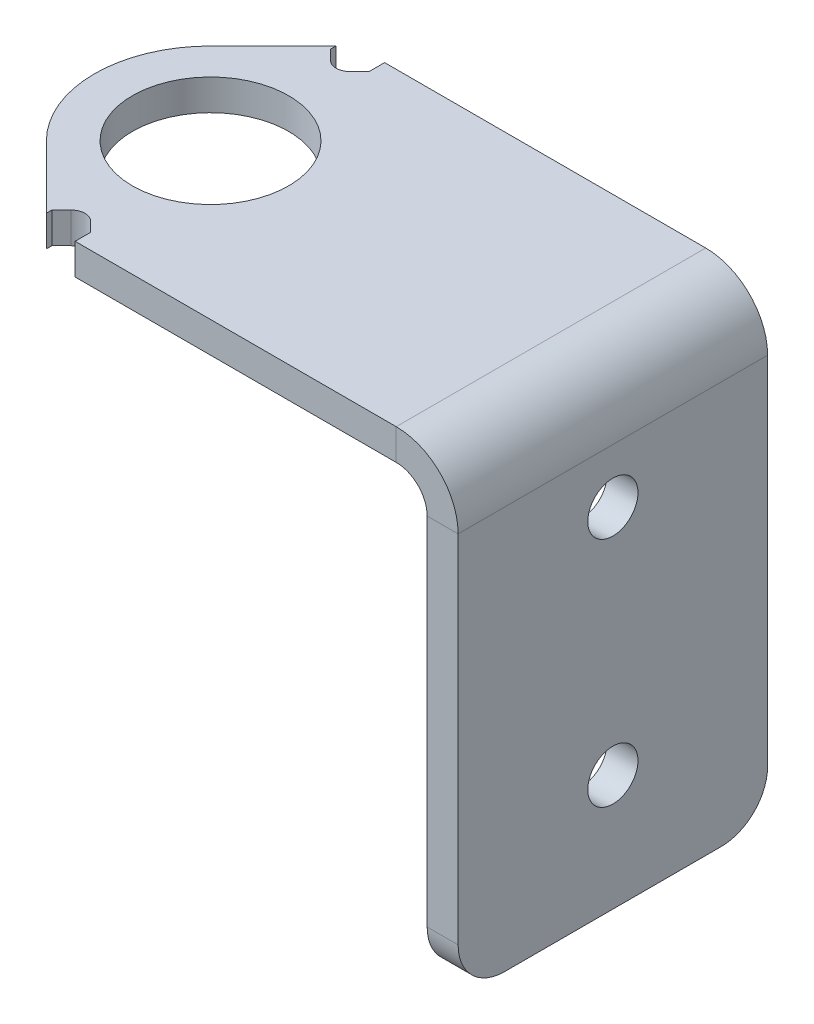
ISO-10303-21;
HEADER;
FILE_DESCRIPTION(('STEP AP214'),'2;1');
FILE_NAME('part.step','',(''),(''),'','','');
FILE_SCHEMA(('AUTOMOTIVE_DESIGN { 1 0 10303 214 1 1 1 1 }'));
ENDSEC;
DATA;
#1=APPLICATION_CONTEXT('core data for automotive mechanical design processes');
#2=APPLICATION_PROTOCOL_DEFINITION('international standard','automotive_design',2000,#1);
#3=PRODUCT_CONTEXT('',#1,'mechanical');
#4=PRODUCT('Part','Part','',(#3));
#5=PRODUCT_RELATED_PRODUCT_CATEGORY('part','',(#4));
#6=PRODUCT_DEFINITION_FORMATION('','',#4);
#7=PRODUCT_DEFINITION_CONTEXT('part definition',#1,'design');
#8=PRODUCT_DEFINITION('design','',#6,#7);
#9=PRODUCT_DEFINITION_SHAPE('','',#8);
#10=(LENGTH_UNIT() NAMED_UNIT(*) SI_UNIT(.MILLI.,.METRE.));
#11=(NAMED_UNIT(*) PLANE_ANGLE_UNIT() SI_UNIT($,.RADIAN.));
#12=(NAMED_UNIT(*) SI_UNIT($,.STERADIAN.) SOLID_ANGLE_UNIT());
#13=UNCERTAINTY_MEASURE_WITH_UNIT(LENGTH_MEASURE(1.E-05),#10,'distance_accuracy_value','');
#14=(GEOMETRIC_REPRESENTATION_CONTEXT(3) GLOBAL_UNCERTAINTY_ASSIGNED_CONTEXT((#13)) GLOBAL_UNIT_ASSIGNED_CONTEXT((#10,
#11,#12)) REPRESENTATION_CONTEXT('',''));
#15=CARTESIAN_POINT('',(0.,0.,0.));
#16=DIRECTION('',(0.,0.,1.));
#17=DIRECTION('',(1.,0.,0.));
#18=AXIS2_PLACEMENT_3D('',#15,#16,#17);
#19=CARTESIAN_POINT('',(27.3941391414775,60.939670459,7.00000000085682));
#20=DIRECTION('',(0.,-1.,0.));
#21=DIRECTION('',(0.,0.,1.));
#22=AXIS2_PLACEMENT_3D('',#19,#20,#21);
#23=PLANE('',#22);
#24=CARTESIAN_POINT('',(-22.3182498382051,60.939670459,0.));
#25=DIRECTION('',(0.,-1.,0.));
#26=DIRECTION('',(0.,0.,1.));
#27=AXIS2_PLACEMENT_3D('',#24,#25,#26);
#28=CIRCLE('',#27,5.05000000000001);
#29=CARTESIAN_POINT('',(-22.3182498382051,60.939670459,5.05000000000001));
#30=VERTEX_POINT('',#29);
#31=EDGE_CURVE('E301',#30,#30,#28,.T.);
#32=ORIENTED_EDGE('',*,*,#31,.F.);
#33=EDGE_LOOP('',(#32));
#34=FACE_BOUND('',#33,.T.);
#35=DIRECTION('',(0.707106781186553,0.,-0.707106781186542));
#36=VECTOR('',#35,1.);
#37=CARTESIAN_POINT('',(-15.034124919556,60.939670459,-15.0341249195562));
#38=LINE('',#37,#36);
#39=CARTESIAN_POINT('',(-21.6932498382051,60.939670459,-8.37500000090725));
#40=VERTEX_POINT('',#39);
#41=CARTESIAN_POINT('',(-21.0682498382051,60.939670459,-9.00000000090724));
#42=VERTEX_POINT('',#41);
#43=EDGE_CURVE('E229',#40,#42,#38,.T.);
#44=ORIENTED_EDGE('',*,*,#43,.T.);
#45=DIRECTION('',(0.,0.,1.));
#46=VECTOR('',#45,1.);
#47=CARTESIAN_POINT('',(-21.0682498382051,60.939670459,0.));
#48=LINE('',#47,#46);
#49=CARTESIAN_POINT('',(-21.0682498382051,60.939670459,-10.0000000009072));
#50=VERTEX_POINT('',#49);
#51=EDGE_CURVE('E227',#50,#42,#48,.T.);
#52=ORIENTED_EDGE('',*,*,#51,.F.);
#53=DIRECTION('',(1.,0.,0.));
#54=VECTOR('',#53,1.);
#55=CARTESIAN_POINT('',(-22.9248515533643,60.939670459,-10.0000000009072));
#56=LINE('',#55,#54);
#57=CARTESIAN_POINT('',(-0.318249837999999,60.939670459,-10.0000000009072));
#58=VERTEX_POINT('',#57);
#59=EDGE_CURVE('E48',#50,#58,#56,.T.);
#60=ORIENTED_EDGE('',*,*,#59,.T.);
#61=DIRECTION('',(0.,0.,1.));
#62=VECTOR('',#61,1.);
#63=CARTESIAN_POINT('',(-0.318249837999995,60.939670459,7.00000000085682));
#64=LINE('',#63,#62);
#65=CARTESIAN_POINT('',(-0.318249837999995,60.939670459,10.0000000008568));
#66=VERTEX_POINT('',#65);
#67=EDGE_CURVE('E383',#58,#66,#64,.T.);
#68=ORIENTED_EDGE('',*,*,#67,.T.);
#69=DIRECTION('',(-1.,0.,0.));
#70=VECTOR('',#69,1.);
#71=CARTESIAN_POINT('',(27.3941391414775,60.939670459,10.0000000008568));
#72=LINE('',#71,#70);
#73=CARTESIAN_POINT('',(-21.0682498382051,60.939670459,10.0000000008568));
#74=VERTEX_POINT('',#73);
#75=EDGE_CURVE('E363',#66,#74,#72,.T.);
#76=ORIENTED_EDGE('',*,*,#75,.T.);
#77=DIRECTION('',(0.,0.,-1.));
#78=VECTOR('',#77,1.);
#79=CARTESIAN_POINT('',(-21.0682498382051,60.939670459,0.));
#80=LINE('',#79,#78);
#81=CARTESIAN_POINT('',(-21.0682498382051,60.939670459,9.00000000090724));
#82=VERTEX_POINT('',#81);
#83=EDGE_CURVE('E263',#74,#82,#80,.T.);
#84=ORIENTED_EDGE('',*,*,#83,.T.);
#85=DIRECTION('',(0.707106781186553,0.,0.707106781186542));
#86=VECTOR('',#85,1.);
#87=CARTESIAN_POINT('',(-15.034124919556,60.939670459,15.0341249195562));
#88=LINE('',#87,#86);
#89=CARTESIAN_POINT('',(-21.6932498382051,60.939670459,8.37500000090725));
#90=VERTEX_POINT('',#89);
#91=EDGE_CURVE('E245',#90,#82,#88,.T.);
#92=ORIENTED_EDGE('',*,*,#91,.F.);
#93=CARTESIAN_POINT('',(-22.3182498382051,60.939670459,9.00000000090725));
#94=DIRECTION('',(0.,-1.,0.));
#95=DIRECTION('',(1.,0.,0.));
#96=AXIS2_PLACEMENT_3D('',#93,#94,#95);
#97=CIRCLE('',#96,0.88388347648318);
#98=CARTESIAN_POINT('',(-22.9432498382051,60.939670459,8.37500000090725));
#99=VERTEX_POINT('',#98);
#100=EDGE_CURVE('E251',#99,#90,#97,.T.);
#101=ORIENTED_EDGE('',*,*,#100,.F.);
#102=DIRECTION('',(0.707106781186552,0.,-0.707106781186543));
#103=VECTOR('',#102,1.);
#104=CARTESIAN_POINT('',(-7.28412491864877,60.939670459,-7.28412491864887));
#105=LINE('',#104,#103);
#106=CARTESIAN_POINT('',(-23.5682498382051,60.939670459,9.00000000090725));
#107=VERTEX_POINT('',#106);
#108=EDGE_CURVE('E269',#107,#99,#105,.T.);
#109=ORIENTED_EDGE('',*,*,#108,.F.);
#110=DIRECTION('',(0.,0.,1.));
#111=VECTOR('',#110,1.);
#112=CARTESIAN_POINT('',(-23.5682498382051,60.939670459,0.));
#113=LINE('',#112,#111);
#114=CARTESIAN_POINT('',(-23.5682498382051,60.939670459,9.35660171601605));
#115=VERTEX_POINT('',#114);
#116=EDGE_CURVE('E266',#107,#115,#113,.T.);
#117=ORIENTED_EDGE('',*,*,#116,.T.);
#118=DIRECTION('',(-0.707106781186547,0.,-0.707106781186548));
#119=VECTOR('',#118,1.);
#120=CARTESIAN_POINT('',(-22.9248515533643,60.939670459,10.0000000008568));
#121=LINE('',#120,#119);
#122=CARTESIAN_POINT('',(-27.6215506962383,60.939670459,5.3033008579828));
#123=VERTEX_POINT('',#122);
#124=EDGE_CURVE('E373',#115,#123,#121,.T.);
#125=ORIENTED_EDGE('',*,*,#124,.T.);
#126=CARTESIAN_POINT('',(-22.3182498382303,60.939670459,-2.52183128379895E-11));
#127=DIRECTION('',(0.,-1.,0.));
#128=DIRECTION('',(0.,0.,1.));
#129=AXIS2_PLACEMENT_3D('',#126,#127,#128);
#130=CIRCLE('',#129,7.49999999873981);
#131=CARTESIAN_POINT('',(-27.6215506962383,60.939670459,-5.30330085803323));
#132=VERTEX_POINT('',#131);
#133=EDGE_CURVE('E375',#123,#132,#130,.T.);
#134=ORIENTED_EDGE('',*,*,#133,.T.);
#135=DIRECTION('',(0.707106781186546,0.,-0.707106781186549));
#136=VECTOR('',#135,1.);
#137=CARTESIAN_POINT('',(-27.6215506962383,60.939670459,-5.30330085803323));
#138=LINE('',#137,#136);
#139=CARTESIAN_POINT('',(-23.5682498382051,60.939670459,-9.35660171606648));
#140=VERTEX_POINT('',#139);
#141=EDGE_CURVE('E378',#132,#140,#138,.T.);
#142=ORIENTED_EDGE('',*,*,#141,.T.);
#143=DIRECTION('',(0.,0.,-1.));
#144=VECTOR('',#143,1.);
#145=CARTESIAN_POINT('',(-23.5682498382051,60.939670459,0.));
#146=LINE('',#145,#144);
#147=CARTESIAN_POINT('',(-23.5682498382051,60.939670459,-9.00000000090725));
#148=VERTEX_POINT('',#147);
#149=EDGE_CURVE('E61',#148,#140,#146,.T.);
#150=ORIENTED_EDGE('',*,*,#149,.F.);
#151=DIRECTION('',(0.707106781186552,0.,0.707106781186543));
#152=VECTOR('',#151,1.);
#153=CARTESIAN_POINT('',(-7.28412491864877,60.939670459,7.28412491864887));
#154=LINE('',#153,#152);
#155=CARTESIAN_POINT('',(-22.9432498382051,60.939670459,-8.37500000090725));
#156=VERTEX_POINT('',#155);
#157=EDGE_CURVE('E204',#148,#156,#154,.T.);
#158=ORIENTED_EDGE('',*,*,#157,.T.);
#159=CARTESIAN_POINT('',(-22.3182498382051,60.939670459,-9.00000000090725));
#160=DIRECTION('',(0.,-1.,0.));
#161=DIRECTION('',(1.,0.,0.));
#162=AXIS2_PLACEMENT_3D('',#159,#160,#161);
#163=CIRCLE('',#162,0.88388347648318);
#164=EDGE_CURVE('E232',#156,#40,#163,.F.);
#165=ORIENTED_EDGE('',*,*,#164,.T.);
#166=EDGE_LOOP('',(#44,#52,#60,#68,#76,#84,#92,#101,#109,#117,#125,#134,#142,#150,#158,#165));
#167=FACE_BOUND('',#166,.T.);
#168=ADVANCED_FACE('F44',(#34,#167),#23,.T.);
#169=CARTESIAN_POINT('',(27.3941391414775,62.939670459,7.00000000085682));
#170=DIRECTION('',(0.,-1.,0.));
#171=DIRECTION('',(0.,0.,1.));
#172=AXIS2_PLACEMENT_3D('',#169,#170,#171);
#173=PLANE('',#172);
#174=CARTESIAN_POINT('',(-22.3182498382051,62.939670459,0.));
#175=DIRECTION('',(0.,-1.,0.));
#176=DIRECTION('',(0.,0.,1.));
#177=AXIS2_PLACEMENT_3D('',#174,#175,#176);
#178=CIRCLE('',#177,5.05000000000001);
#179=CARTESIAN_POINT('',(-22.3182498382051,62.939670459,5.05000000000001));
#180=VERTEX_POINT('',#179);
#181=EDGE_CURVE('E360',#180,#180,#178,.T.);
#182=ORIENTED_EDGE('',*,*,#181,.T.);
#183=EDGE_LOOP('',(#182));
#184=FACE_BOUND('',#183,.T.);
#185=DIRECTION('',(0.,0.,1.));
#186=VECTOR('',#185,1.);
#187=CARTESIAN_POINT('',(-21.0682498382051,62.939670459,7.00000000085682));
#188=LINE('',#187,#186);
#189=CARTESIAN_POINT('',(-21.0682498382051,62.939670459,-10.0000000009072));
#190=VERTEX_POINT('',#189);
#191=CARTESIAN_POINT('',(-21.0682498382051,62.939670459,-9.00000000090724));
#192=VERTEX_POINT('',#191);
#193=EDGE_CURVE('E203',#190,#192,#188,.T.);
#194=ORIENTED_EDGE('',*,*,#193,.T.);
#195=DIRECTION('',(0.707106781186553,0.,-0.707106781186542));
#196=VECTOR('',#195,1.);
#197=CARTESIAN_POINT('',(-15.034124919556,62.939670459,-15.0341249195562));
#198=LINE('',#197,#196);
#199=CARTESIAN_POINT('',(-21.6932498382051,62.939670459,-8.37500000090725));
#200=VERTEX_POINT('',#199);
#201=EDGE_CURVE('E221',#200,#192,#198,.T.);
#202=ORIENTED_EDGE('',*,*,#201,.F.);
#203=CARTESIAN_POINT('',(-22.3182498382051,62.939670459,-9.00000000090725));
#204=DIRECTION('',(0.,-1.,0.));
#205=DIRECTION('',(1.,0.,0.));
#206=AXIS2_PLACEMENT_3D('',#203,#204,#205);
#207=CIRCLE('',#206,0.88388347648318);
#208=CARTESIAN_POINT('',(-22.9432498382051,62.939670459,-8.37500000090724));
#209=VERTEX_POINT('',#208);
#210=EDGE_CURVE('E218',#209,#200,#207,.F.);
#211=ORIENTED_EDGE('',*,*,#210,.F.);
#212=DIRECTION('',(0.707106781186552,0.,0.707106781186543));
#213=VECTOR('',#212,1.);
#214=CARTESIAN_POINT('',(-7.28412491864877,62.939670459,7.28412491864887));
#215=LINE('',#214,#213);
#216=CARTESIAN_POINT('',(-23.5682498382051,62.939670459,-9.00000000090725));
#217=VERTEX_POINT('',#216);
#218=EDGE_CURVE('E209',#217,#209,#215,.T.);
#219=ORIENTED_EDGE('',*,*,#218,.F.);
#220=DIRECTION('',(0.,0.,1.));
#221=VECTOR('',#220,1.);
#222=CARTESIAN_POINT('',(-23.5682498382051,62.939670459,7.00000000085682));
#223=LINE('',#222,#221);
#224=CARTESIAN_POINT('',(-23.5682498382051,62.939670459,-9.35660171606647));
#225=VERTEX_POINT('',#224);
#226=EDGE_CURVE('E194',#217,#225,#223,.F.);
#227=ORIENTED_EDGE('',*,*,#226,.T.);
#228=DIRECTION('',(0.707106781186546,0.,-0.707106781186549));
#229=VECTOR('',#228,1.);
#230=CARTESIAN_POINT('',(-27.6215506962383,62.939670459,-5.30330085803323));
#231=LINE('',#230,#229);
#232=CARTESIAN_POINT('',(-27.6215506962383,62.939670459,-5.30330085803323));
#233=VERTEX_POINT('',#232);
#234=EDGE_CURVE('E370',#233,#225,#231,.T.);
#235=ORIENTED_EDGE('',*,*,#234,.F.);
#236=CARTESIAN_POINT('',(-22.3182498382303,62.939670459,-2.52183128379895E-11));
#237=DIRECTION('',(0.,-1.,0.));
#238=DIRECTION('',(0.,0.,1.));
#239=AXIS2_PLACEMENT_3D('',#236,#237,#238);
#240=CIRCLE('',#239,7.49999999873981);
#241=CARTESIAN_POINT('',(-27.6215506962383,62.939670459,5.3033008579828));
#242=VERTEX_POINT('',#241);
#243=EDGE_CURVE('E366',#242,#233,#240,.T.);
#244=ORIENTED_EDGE('',*,*,#243,.F.);
#245=DIRECTION('',(-0.707106781186547,0.,-0.707106781186548));
#246=VECTOR('',#245,1.);
#247=CARTESIAN_POINT('',(-22.9248515533643,62.939670459,10.0000000008568));
#248=LINE('',#247,#246);
#249=CARTESIAN_POINT('',(-23.5682498382051,62.939670459,9.35660171601605));
#250=VERTEX_POINT('',#249);
#251=EDGE_CURVE('E364',#250,#242,#248,.T.);
#252=ORIENTED_EDGE('',*,*,#251,.F.);
#253=DIRECTION('',(0.,0.,1.));
#254=VECTOR('',#253,1.);
#255=CARTESIAN_POINT('',(-23.5682498382051,62.939670459,7.00000000085682));
#256=LINE('',#255,#254);
#257=CARTESIAN_POINT('',(-23.5682498382051,62.939670459,9.00000000090725));
#258=VERTEX_POINT('',#257);
#259=EDGE_CURVE('E259',#258,#250,#256,.T.);
#260=ORIENTED_EDGE('',*,*,#259,.F.);
#261=DIRECTION('',(0.707106781186552,0.,-0.707106781186543));
#262=VECTOR('',#261,1.);
#263=CARTESIAN_POINT('',(-7.28412491864877,62.939670459,-7.28412491864887));
#264=LINE('',#263,#262);
#265=CARTESIAN_POINT('',(-22.9432498382051,62.939670459,8.37500000090725));
#266=VERTEX_POINT('',#265);
#267=EDGE_CURVE('E256',#258,#266,#264,.T.);
#268=ORIENTED_EDGE('',*,*,#267,.T.);
#269=CARTESIAN_POINT('',(-22.3182498382051,62.939670459,9.00000000090725));
#270=DIRECTION('',(0.,-1.,0.));
#271=DIRECTION('',(1.,0.,0.));
#272=AXIS2_PLACEMENT_3D('',#269,#270,#271);
#273=CIRCLE('',#272,0.88388347648318);
#274=CARTESIAN_POINT('',(-21.6932498382051,62.939670459,8.37500000090725));
#275=VERTEX_POINT('',#274);
#276=EDGE_CURVE('E252',#266,#275,#273,.T.);
#277=ORIENTED_EDGE('',*,*,#276,.T.);
#278=DIRECTION('',(0.707106781186553,0.,0.707106781186542));
#279=VECTOR('',#278,1.);
#280=CARTESIAN_POINT('',(-15.034124919556,62.939670459,15.0341249195562));
#281=LINE('',#280,#279);
#282=CARTESIAN_POINT('',(-21.0682498382051,62.939670459,9.00000000090724));
#283=VERTEX_POINT('',#282);
#284=EDGE_CURVE('E247',#275,#283,#281,.T.);
#285=ORIENTED_EDGE('',*,*,#284,.T.);
#286=DIRECTION('',(0.,0.,1.));
#287=VECTOR('',#286,1.);
#288=CARTESIAN_POINT('',(-21.0682498382051,62.939670459,7.00000000085682));
#289=LINE('',#288,#287);
#290=CARTESIAN_POINT('',(-21.0682498382051,62.939670459,10.0000000008568));
#291=VERTEX_POINT('',#290);
#292=EDGE_CURVE('E250',#291,#283,#289,.F.);
#293=ORIENTED_EDGE('',*,*,#292,.F.);
#294=DIRECTION('',(-1.,0.,0.));
#295=VECTOR('',#294,1.);
#296=CARTESIAN_POINT('',(27.3941391414775,62.939670459,10.0000000008568));
#297=LINE('',#296,#295);
#298=CARTESIAN_POINT('',(-0.318249837999998,62.939670459,10.0000000008568));
#299=VERTEX_POINT('',#298);
#300=EDGE_CURVE('E367',#299,#291,#297,.T.);
#301=ORIENTED_EDGE('',*,*,#300,.F.);
#302=DIRECTION('',(0.,0.,1.));
#303=VECTOR('',#302,1.);
#304=CARTESIAN_POINT('',(-0.318249837999995,62.939670459,7.00000000085682));
#305=LINE('',#304,#303);
#306=CARTESIAN_POINT('',(-0.318249837999998,62.939670459,-10.0000000009072));
#307=VERTEX_POINT('',#306);
#308=EDGE_CURVE('E53',#307,#299,#305,.T.);
#309=ORIENTED_EDGE('',*,*,#308,.F.);
#310=DIRECTION('',(1.,0.,0.));
#311=VECTOR('',#310,1.);
#312=CARTESIAN_POINT('',(-22.9248515533643,62.939670459,-10.0000000009072));
#313=LINE('',#312,#311);
#314=EDGE_CURVE('E372',#190,#307,#313,.T.);
#315=ORIENTED_EDGE('',*,*,#314,.F.);
#316=EDGE_LOOP('',(#194,#202,#211,#219,#227,#235,#244,#252,#260,#268,#277,#285,#293,#301,#309,#315));
#317=FACE_BOUND('',#316,.T.);
#318=ADVANCED_FACE('F216',(#184,#317),#173,.F.);
#319=CARTESIAN_POINT('',(-22.9248515533643,62.939670459,-10.0000000009072));
#320=DIRECTION('',(0.,0.,-1.));
#321=DIRECTION('',(0.,-1.,0.));
#322=AXIS2_PLACEMENT_3D('',#319,#320,#321);
#323=PLANE('',#322);
#324=ORIENTED_EDGE('',*,*,#59,.F.);
#325=DIRECTION('',(0.,-1.,0.));
#326=VECTOR('',#325,1.);
#327=CARTESIAN_POINT('',(-21.0682498382051,60.939670459,-10.0000000009072));
#328=LINE('',#327,#326);
#329=EDGE_CURVE('E243',#50,#190,#328,.F.);
#330=ORIENTED_EDGE('',*,*,#329,.T.);
#331=ORIENTED_EDGE('',*,*,#314,.T.);
#332=DIRECTION('',(0.,-1.,0.));
#333=VECTOR('',#332,1.);
#334=CARTESIAN_POINT('',(-0.318249837999995,62.939670459,-10.0000000009072));
#335=LINE('',#334,#333);
#336=EDGE_CURVE('E389',#307,#58,#335,.T.);
#337=ORIENTED_EDGE('',*,*,#336,.T.);
#338=EDGE_LOOP('',(#324,#330,#331,#337));
#339=FACE_BOUND('',#338,.T.);
#340=ADVANCED_FACE('F434',(#339),#323,.T.);
#341=CARTESIAN_POINT('',(-27.6215506962383,62.939670459,-5.30330085803323));
#342=DIRECTION('',(-0.707106781186549,0.,-0.707106781186546));
#343=DIRECTION('',(-0.707106781186546,0.,0.707106781186549));
#344=AXIS2_PLACEMENT_3D('',#341,#342,#343);
#345=PLANE('',#344);
#346=ORIENTED_EDGE('',*,*,#234,.T.);
#347=DIRECTION('',(0.,-1.,0.));
#348=VECTOR('',#347,1.);
#349=CARTESIAN_POINT('',(-23.5682498382051,60.939670459,-9.35660171606647));
#350=LINE('',#349,#348);
#351=EDGE_CURVE('E198',#140,#225,#350,.F.);
#352=ORIENTED_EDGE('',*,*,#351,.F.);
#353=ORIENTED_EDGE('',*,*,#141,.F.);
#354=DIRECTION('',(0.,-1.,0.));
#355=VECTOR('',#354,1.);
#356=CARTESIAN_POINT('',(-27.6215506962383,62.939670459,-5.30330085803323));
#357=LINE('',#356,#355);
#358=EDGE_CURVE('E381',#233,#132,#357,.T.);
#359=ORIENTED_EDGE('',*,*,#358,.F.);
#360=EDGE_LOOP('',(#346,#352,#353,#359));
#361=FACE_BOUND('',#360,.T.);
#362=ADVANCED_FACE('F432',(#361),#345,.T.);
#363=CARTESIAN_POINT('',(27.3941391414775,62.939670459,10.0000000008568));
#364=DIRECTION('',(0.,0.,1.));
#365=DIRECTION('',(1.,0.,0.));
#366=AXIS2_PLACEMENT_3D('',#363,#364,#365);
#367=PLANE('',#366);
#368=ORIENTED_EDGE('',*,*,#300,.T.);
#369=DIRECTION('',(0.,-1.,0.));
#370=VECTOR('',#369,1.);
#371=CARTESIAN_POINT('',(-21.0682498382051,60.939670459,10.0000000008568));
#372=LINE('',#371,#370);
#373=EDGE_CURVE('E69',#74,#291,#372,.F.);
#374=ORIENTED_EDGE('',*,*,#373,.F.);
#375=ORIENTED_EDGE('',*,*,#75,.F.);
#376=DIRECTION('',(0.,1.,0.));
#377=VECTOR('',#376,1.);
#378=CARTESIAN_POINT('',(-0.318249837999995,62.939670459,10.0000000008568));
#379=LINE('',#378,#377);
#380=EDGE_CURVE('E12',#66,#299,#379,.T.);
#381=ORIENTED_EDGE('',*,*,#380,.T.);
#382=EDGE_LOOP('',(#368,#374,#375,#381));
#383=FACE_BOUND('',#382,.T.);
#384=ADVANCED_FACE('F46',(#383),#367,.T.);
#385=CARTESIAN_POINT('',(-22.9248515533643,62.939670459,10.0000000008568));
#386=DIRECTION('',(-0.707106781186548,0.,0.707106781186547));
#387=DIRECTION('',(0.707106781186547,0.,0.707106781186548));
#388=AXIS2_PLACEMENT_3D('',#385,#386,#387);
#389=PLANE('',#388);
#390=ORIENTED_EDGE('',*,*,#124,.F.);
#391=DIRECTION('',(0.,-1.,0.));
#392=VECTOR('',#391,1.);
#393=CARTESIAN_POINT('',(-23.5682498382051,60.939670459,9.35660171601605));
#394=LINE('',#393,#392);
#395=EDGE_CURVE('E281',#115,#250,#394,.F.);
#396=ORIENTED_EDGE('',*,*,#395,.T.);
#397=ORIENTED_EDGE('',*,*,#251,.T.);
#398=DIRECTION('',(0.,-1.,0.));
#399=VECTOR('',#398,1.);
#400=CARTESIAN_POINT('',(-27.6215506962383,62.939670459,5.3033008579828));
#401=LINE('',#400,#399);
#402=EDGE_CURVE('E384',#242,#123,#401,.T.);
#403=ORIENTED_EDGE('',*,*,#402,.T.);
#404=EDGE_LOOP('',(#390,#396,#397,#403));
#405=FACE_BOUND('',#404,.T.);
#406=ADVANCED_FACE('F425',(#405),#389,.T.);
#407=CARTESIAN_POINT('',(-22.3182498382303,62.939670459,-2.52183128379895E-11));
#408=DIRECTION('',(0.,-1.,0.));
#409=DIRECTION('',(0.,0.,1.));
#410=AXIS2_PLACEMENT_3D('',#407,#408,#409);
#411=CYLINDRICAL_SURFACE('',#410,7.49999999873981);
#412=ORIENTED_EDGE('',*,*,#133,.F.);
#413=ORIENTED_EDGE('',*,*,#402,.F.);
#414=ORIENTED_EDGE('',*,*,#243,.T.);
#415=ORIENTED_EDGE('',*,*,#358,.T.);
#416=EDGE_LOOP('',(#412,#413,#414,#415));
#417=FACE_BOUND('',#416,.T.);
#418=ADVANCED_FACE('F430',(#417),#411,.T.);
#419=CARTESIAN_POINT('',(-22.3182498382051,60.939670459,0.));
#420=DIRECTION('',(0.,-1.,0.));
#421=DIRECTION('',(0.,0.,1.));
#422=AXIS2_PLACEMENT_3D('',#419,#420,#421);
#423=CYLINDRICAL_SURFACE('',#422,5.05000000000001);
#424=ORIENTED_EDGE('',*,*,#181,.F.);
#425=EDGE_LOOP('',(#424));
#426=FACE_BOUND('',#425,.T.);
#427=ORIENTED_EDGE('',*,*,#31,.T.);
#428=EDGE_LOOP('',(#427));
#429=FACE_BOUND('',#428,.T.);
#430=ADVANCED_FACE('F456',(#426,#429),#423,.F.);
#431=CARTESIAN_POINT('',(3.681750162,55.439670459,0.));
#432=DIRECTION('',(1.,0.,0.));
#433=DIRECTION('',(0.,0.,-1.));
#434=AXIS2_PLACEMENT_3D('',#431,#432,#433);
#435=CYLINDRICAL_SURFACE('',#434,1.62099999999999);
#436=CARTESIAN_POINT('',(1.681750162,55.439670459,0.));
#437=DIRECTION('',(1.,0.,0.));
#438=DIRECTION('',(0.,0.,-1.));
#439=AXIS2_PLACEMENT_3D('',#436,#437,#438);
#440=CIRCLE('',#439,1.62099999999999);
#441=CARTESIAN_POINT('',(1.681750162,55.439670459,-1.62099999999999));
#442=VERTEX_POINT('',#441);
#443=EDGE_CURVE('E310',#442,#442,#440,.T.);
#444=ORIENTED_EDGE('',*,*,#443,.F.);
#445=EDGE_LOOP('',(#444));
#446=FACE_BOUND('',#445,.T.);
#447=CARTESIAN_POINT('',(3.681750162,55.439670459,0.));
#448=DIRECTION('',(1.,0.,0.));
#449=DIRECTION('',(0.,0.,-1.));
#450=AXIS2_PLACEMENT_3D('',#447,#448,#449);
#451=CIRCLE('',#450,1.62099999999999);
#452=CARTESIAN_POINT('',(3.681750162,55.439670459,-1.62099999999999));
#453=VERTEX_POINT('',#452);
#454=EDGE_CURVE('E347',#453,#453,#451,.T.);
#455=ORIENTED_EDGE('',*,*,#454,.T.);
#456=EDGE_LOOP('',(#455));
#457=FACE_BOUND('',#456,.T.);
#458=ADVANCED_FACE('F460',(#446,#457),#435,.F.);
#459=CARTESIAN_POINT('',(3.681750162,40.439670459,0.));
#460=DIRECTION('',(1.,0.,0.));
#461=DIRECTION('',(0.,0.,-1.));
#462=AXIS2_PLACEMENT_3D('',#459,#460,#461);
#463=CYLINDRICAL_SURFACE('',#462,1.62099999999999);
#464=CARTESIAN_POINT('',(1.681750162,40.439670459,0.));
#465=DIRECTION('',(1.,0.,0.));
#466=DIRECTION('',(0.,0.,-1.));
#467=AXIS2_PLACEMENT_3D('',#464,#465,#466);
#468=CIRCLE('',#467,1.62099999999999);
#469=CARTESIAN_POINT('',(1.681750162,40.439670459,-1.62099999999999));
#470=VERTEX_POINT('',#469);
#471=EDGE_CURVE('E313',#470,#470,#468,.T.);
#472=ORIENTED_EDGE('',*,*,#471,.F.);
#473=EDGE_LOOP('',(#472));
#474=FACE_BOUND('',#473,.T.);
#475=CARTESIAN_POINT('',(3.681750162,40.439670459,0.));
#476=DIRECTION('',(1.,0.,0.));
#477=DIRECTION('',(0.,0.,-1.));
#478=AXIS2_PLACEMENT_3D('',#475,#476,#477);
#479=CIRCLE('',#478,1.62099999999999);
#480=CARTESIAN_POINT('',(3.681750162,40.439670459,-1.62099999999999));
#481=VERTEX_POINT('',#480);
#482=EDGE_CURVE('E344',#481,#481,#479,.T.);
#483=ORIENTED_EDGE('',*,*,#482,.T.);
#484=EDGE_LOOP('',(#483));
#485=FACE_BOUND('',#484,.T.);
#486=ADVANCED_FACE('F465',(#474,#485),#463,.F.);
#487=CARTESIAN_POINT('',(3.681750162,35.9396704599072,7.00000000085682));
#488=DIRECTION('',(-1.,0.,0.));
#489=DIRECTION('',(0.,0.,1.));
#490=AXIS2_PLACEMENT_3D('',#487,#488,#489);
#491=CYLINDRICAL_SURFACE('',#490,3.);
#492=CARTESIAN_POINT('',(1.681750162,35.9396704599072,7.00000000085682));
#493=DIRECTION('',(-1.,0.,0.));
#494=DIRECTION('',(0.,0.,1.));
#495=AXIS2_PLACEMENT_3D('',#492,#493,#494);
#496=CIRCLE('',#495,3.);
#497=CARTESIAN_POINT('',(1.681750162,32.9396704599072,7.00000000085682));
#498=VERTEX_POINT('',#497);
#499=CARTESIAN_POINT('',(1.681750162,35.9396704599072,10.0000000008568));
#500=VERTEX_POINT('',#499);
#501=EDGE_CURVE('E318',#498,#500,#496,.T.);
#502=ORIENTED_EDGE('',*,*,#501,.F.);
#503=DIRECTION('',(-1.,0.,0.));
#504=VECTOR('',#503,1.);
#505=CARTESIAN_POINT('',(3.681750162,32.9396704599072,7.00000000085682));
#506=LINE('',#505,#504);
#507=CARTESIAN_POINT('',(3.681750162,32.9396704599072,7.00000000085682));
#508=VERTEX_POINT('',#507);
#509=EDGE_CURVE('E334',#508,#498,#506,.T.);
#510=ORIENTED_EDGE('',*,*,#509,.F.);
#511=CARTESIAN_POINT('',(3.681750162,35.9396704599072,7.00000000085682));
#512=DIRECTION('',(-1.,0.,0.));
#513=DIRECTION('',(0.,0.,1.));
#514=AXIS2_PLACEMENT_3D('',#511,#512,#513);
#515=CIRCLE('',#514,3.);
#516=CARTESIAN_POINT('',(3.681750162,35.9396704599072,10.0000000008568));
#517=VERTEX_POINT('',#516);
#518=EDGE_CURVE('E341',#508,#517,#515,.T.);
#519=ORIENTED_EDGE('',*,*,#518,.T.);
#520=DIRECTION('',(-1.,0.,0.));
#521=VECTOR('',#520,1.);
#522=CARTESIAN_POINT('',(3.681750162,35.9396704599072,10.0000000008568));
#523=LINE('',#522,#521);
#524=EDGE_CURVE('E339',#517,#500,#523,.T.);
#525=ORIENTED_EDGE('',*,*,#524,.T.);
#526=EDGE_LOOP('',(#502,#510,#519,#525));
#527=FACE_BOUND('',#526,.T.);
#528=ADVANCED_FACE('F495',(#527),#491,.T.);
#529=CARTESIAN_POINT('',(3.681750162,32.9396704599072,-7.00000000090725));
#530=DIRECTION('',(0.,-1.,0.));
#531=DIRECTION('',(0.,0.,-1.));
#532=AXIS2_PLACEMENT_3D('',#529,#530,#531);
#533=PLANE('',#532);
#534=DIRECTION('',(0.,0.,1.));
#535=VECTOR('',#534,1.);
#536=CARTESIAN_POINT('',(1.681750162,32.9396704599072,-7.00000000090725));
#537=LINE('',#536,#535);
#538=CARTESIAN_POINT('',(1.681750162,32.9396704599072,-7.00000000090725));
#539=VERTEX_POINT('',#538);
#540=EDGE_CURVE('E321',#539,#498,#537,.T.);
#541=ORIENTED_EDGE('',*,*,#540,.F.);
#542=DIRECTION('',(-1.,0.,0.));
#543=VECTOR('',#542,1.);
#544=CARTESIAN_POINT('',(3.681750162,32.9396704599072,-7.00000000090725));
#545=LINE('',#544,#543);
#546=CARTESIAN_POINT('',(3.681750162,32.9396704599072,-7.00000000090725));
#547=VERTEX_POINT('',#546);
#548=EDGE_CURVE('E329',#547,#539,#545,.T.);
#549=ORIENTED_EDGE('',*,*,#548,.F.);
#550=DIRECTION('',(0.,0.,1.));
#551=VECTOR('',#550,1.);
#552=CARTESIAN_POINT('',(3.681750162,32.9396704599072,-7.00000000090725));
#553=LINE('',#552,#551);
#554=EDGE_CURVE('E336',#547,#508,#553,.T.);
#555=ORIENTED_EDGE('',*,*,#554,.T.);
#556=ORIENTED_EDGE('',*,*,#509,.T.);
#557=EDGE_LOOP('',(#541,#549,#555,#556));
#558=FACE_BOUND('',#557,.T.);
#559=ADVANCED_FACE('F491',(#558),#533,.T.);
#560=CARTESIAN_POINT('',(3.681750162,35.9396704599072,-7.00000000090725));
#561=DIRECTION('',(-1.,0.,0.));
#562=DIRECTION('',(0.,0.,1.));
#563=AXIS2_PLACEMENT_3D('',#560,#561,#562);
#564=CYLINDRICAL_SURFACE('',#563,3.);
#565=CARTESIAN_POINT('',(1.681750162,35.9396704599072,-7.00000000090725));
#566=DIRECTION('',(-1.,0.,0.));
#567=DIRECTION('',(0.,0.,1.));
#568=AXIS2_PLACEMENT_3D('',#565,#566,#567);
#569=CIRCLE('',#568,3.);
#570=CARTESIAN_POINT('',(1.681750162,35.9396704599072,-10.0000000009072));
#571=VERTEX_POINT('',#570);
#572=EDGE_CURVE('E324',#571,#539,#569,.T.);
#573=ORIENTED_EDGE('',*,*,#572,.F.);
#574=DIRECTION('',(-1.,0.,0.));
#575=VECTOR('',#574,1.);
#576=CARTESIAN_POINT('',(3.681750162,35.9396704599072,-10.0000000009072));
#577=LINE('',#576,#575);
#578=CARTESIAN_POINT('',(3.681750162,35.9396704599072,-10.0000000009072));
#579=VERTEX_POINT('',#578);
#580=EDGE_CURVE('E305',#579,#571,#577,.T.);
#581=ORIENTED_EDGE('',*,*,#580,.F.);
#582=CARTESIAN_POINT('',(3.681750162,35.9396704599072,-7.00000000090725));
#583=DIRECTION('',(-1.,0.,0.));
#584=DIRECTION('',(0.,0.,1.));
#585=AXIS2_PLACEMENT_3D('',#582,#583,#584);
#586=CIRCLE('',#585,3.);
#587=EDGE_CURVE('E331',#579,#547,#586,.T.);
#588=ORIENTED_EDGE('',*,*,#587,.T.);
#589=ORIENTED_EDGE('',*,*,#548,.T.);
#590=EDGE_LOOP('',(#573,#581,#588,#589));
#591=FACE_BOUND('',#590,.T.);
#592=ADVANCED_FACE('F487',(#591),#564,.T.);
#593=CARTESIAN_POINT('',(1.681750162,35.9396704599072,7.00000000085682));
#594=DIRECTION('',(-1.,0.,0.));
#595=DIRECTION('',(0.,0.,1.));
#596=AXIS2_PLACEMENT_3D('',#593,#594,#595);
#597=PLANE('',#596);
#598=DIRECTION('',(0.,0.,1.));
#599=VECTOR('',#598,1.);
#600=CARTESIAN_POINT('',(1.681750162,58.939670459,7.00000000085682));
#601=LINE('',#600,#599);
#602=CARTESIAN_POINT('',(1.681750162,58.939670459,-10.0000000009072));
#603=VERTEX_POINT('',#602);
#604=CARTESIAN_POINT('',(1.681750162,58.939670459,10.0000000008568));
#605=VERTEX_POINT('',#604);
#606=EDGE_CURVE('E294',#603,#605,#601,.T.);
#607=ORIENTED_EDGE('',*,*,#606,.F.);
#608=DIRECTION('',(0.,-1.,0.));
#609=VECTOR('',#608,1.);
#610=CARTESIAN_POINT('',(1.681750162,86.258661154749,-10.0000000009072));
#611=LINE('',#610,#609);
#612=EDGE_CURVE('E327',#603,#571,#611,.T.);
#613=ORIENTED_EDGE('',*,*,#612,.T.);
#614=ORIENTED_EDGE('',*,*,#572,.T.);
#615=ORIENTED_EDGE('',*,*,#540,.T.);
#616=ORIENTED_EDGE('',*,*,#501,.T.);
#617=DIRECTION('',(0.,1.,0.));
#618=VECTOR('',#617,1.);
#619=CARTESIAN_POINT('',(1.681750162,35.9396704599072,10.0000000008568));
#620=LINE('',#619,#618);
#621=EDGE_CURVE('E316',#500,#605,#620,.T.);
#622=ORIENTED_EDGE('',*,*,#621,.T.);
#623=EDGE_LOOP('',(#607,#613,#614,#615,#616,#622));
#624=FACE_BOUND('',#623,.T.);
#625=ORIENTED_EDGE('',*,*,#471,.T.);
#626=EDGE_LOOP('',(#625));
#627=FACE_BOUND('',#626,.T.);
#628=ORIENTED_EDGE('',*,*,#443,.T.);
#629=EDGE_LOOP('',(#628));
#630=FACE_BOUND('',#629,.T.);
#631=ADVANCED_FACE('F483',(#624,#627,#630),#597,.T.);
#632=CARTESIAN_POINT('',(3.681750162,86.258661154749,-10.0000000009072));
#633=DIRECTION('',(0.,0.,-1.));
#634=DIRECTION('',(-1.,0.,0.));
#635=AXIS2_PLACEMENT_3D('',#632,#633,#634);
#636=PLANE('',#635);
#637=DIRECTION('',(-1.,0.,0.));
#638=VECTOR('',#637,1.);
#639=CARTESIAN_POINT('',(3.681750162,58.939670459,-10.0000000009072));
#640=LINE('',#639,#638);
#641=CARTESIAN_POINT('',(3.681750162,58.939670459,-10.0000000009072));
#642=VERTEX_POINT('',#641);
#643=EDGE_CURVE('E350',#642,#603,#640,.T.);
#644=ORIENTED_EDGE('',*,*,#643,.F.);
#645=DIRECTION('',(0.,-1.,0.));
#646=VECTOR('',#645,1.);
#647=CARTESIAN_POINT('',(3.681750162,86.258661154749,-10.0000000009072));
#648=LINE('',#647,#646);
#649=EDGE_CURVE('E308',#642,#579,#648,.T.);
#650=ORIENTED_EDGE('',*,*,#649,.T.);
#651=ORIENTED_EDGE('',*,*,#580,.T.);
#652=ORIENTED_EDGE('',*,*,#612,.F.);
#653=EDGE_LOOP('',(#644,#650,#651,#652));
#654=FACE_BOUND('',#653,.T.);
#655=ADVANCED_FACE('F479',(#654),#636,.T.);
#656=CARTESIAN_POINT('',(3.681750162,35.9396704599072,7.00000000085682));
#657=DIRECTION('',(-1.,0.,0.));
#658=DIRECTION('',(0.,0.,1.));
#659=AXIS2_PLACEMENT_3D('',#656,#657,#658);
#660=PLANE('',#659);
#661=ORIENTED_EDGE('',*,*,#454,.F.);
#662=EDGE_LOOP('',(#661));
#663=FACE_BOUND('',#662,.T.);
#664=ORIENTED_EDGE('',*,*,#482,.F.);
#665=EDGE_LOOP('',(#664));
#666=FACE_BOUND('',#665,.T.);
#667=ORIENTED_EDGE('',*,*,#649,.F.);
#668=DIRECTION('',(0.,0.,1.));
#669=VECTOR('',#668,1.);
#670=CARTESIAN_POINT('',(3.681750162,58.939670459,7.00000000085682));
#671=LINE('',#670,#669);
#672=CARTESIAN_POINT('',(3.681750162,58.939670459,10.0000000008568));
#673=VERTEX_POINT('',#672);
#674=EDGE_CURVE('E302',#642,#673,#671,.T.);
#675=ORIENTED_EDGE('',*,*,#674,.T.);
#676=DIRECTION('',(0.,1.,0.));
#677=VECTOR('',#676,1.);
#678=CARTESIAN_POINT('',(3.681750162,35.9396704599072,10.0000000008568));
#679=LINE('',#678,#677);
#680=EDGE_CURVE('E299',#517,#673,#679,.T.);
#681=ORIENTED_EDGE('',*,*,#680,.F.);
#682=ORIENTED_EDGE('',*,*,#518,.F.);
#683=ORIENTED_EDGE('',*,*,#554,.F.);
#684=ORIENTED_EDGE('',*,*,#587,.F.);
#685=EDGE_LOOP('',(#667,#675,#681,#682,#683,#684));
#686=FACE_BOUND('',#685,.T.);
#687=ADVANCED_FACE('F475',(#663,#666,#686),#660,.F.);
#688=CARTESIAN_POINT('',(3.681750162,35.9396704599072,10.0000000008568));
#689=DIRECTION('',(0.,0.,1.));
#690=DIRECTION('',(0.,-1.,0.));
#691=AXIS2_PLACEMENT_3D('',#688,#689,#690);
#692=PLANE('',#691);
#693=DIRECTION('',(1.,0.,0.));
#694=VECTOR('',#693,1.);
#695=CARTESIAN_POINT('',(3.681750162,58.939670459,10.0000000008568));
#696=LINE('',#695,#694);
#697=EDGE_CURVE('E353',#605,#673,#696,.T.);
#698=ORIENTED_EDGE('',*,*,#697,.F.);
#699=ORIENTED_EDGE('',*,*,#621,.F.);
#700=ORIENTED_EDGE('',*,*,#524,.F.);
#701=ORIENTED_EDGE('',*,*,#680,.T.);
#702=EDGE_LOOP('',(#698,#699,#700,#701));
#703=FACE_BOUND('',#702,.T.);
#704=ADVANCED_FACE('F471',(#703),#692,.T.);
#705=CARTESIAN_POINT('',(-0.318249837999999,58.939670459,-10.0000000009072));
#706=DIRECTION('',(0.,0.,1.));
#707=DIRECTION('',(1.,0.,0.));
#708=AXIS2_PLACEMENT_3D('',#705,#706,#707);
#709=PLANE('',#708);
#710=ORIENTED_EDGE('',*,*,#336,.F.);
#711=CARTESIAN_POINT('',(-0.318249837999999,58.939670459,-10.0000000009072));
#712=DIRECTION('',(0.,0.,-1.));
#713=DIRECTION('',(-1.,0.,0.));
#714=AXIS2_PLACEMENT_3D('',#711,#712,#713);
#715=CIRCLE('',#714,4.);
#716=EDGE_CURVE('E285',#307,#642,#715,.T.);
#717=ORIENTED_EDGE('',*,*,#716,.T.);
#718=ORIENTED_EDGE('',*,*,#643,.T.);
#719=CARTESIAN_POINT('',(-0.318249837999999,58.939670459,-10.0000000009072));
#720=DIRECTION('',(0.,0.,-1.));
#721=DIRECTION('',(-1.,0.,0.));
#722=AXIS2_PLACEMENT_3D('',#719,#720,#721);
#723=CIRCLE('',#722,2.);
#724=EDGE_CURVE('E288',#58,#603,#723,.T.);
#725=ORIENTED_EDGE('',*,*,#724,.F.);
#726=EDGE_LOOP('',(#710,#717,#718,#725));
#727=FACE_BOUND('',#726,.T.);
#728=ADVANCED_FACE('F474',(#727),#709,.F.);
#729=CARTESIAN_POINT('',(-0.318249837999999,58.939670459,10.0000000008568));
#730=DIRECTION('',(0.,0.,-1.));
#731=DIRECTION('',(-1.,0.,0.));
#732=AXIS2_PLACEMENT_3D('',#729,#730,#731);
#733=PLANE('',#732);
#734=CARTESIAN_POINT('',(-0.318249837999999,58.939670459,10.0000000008568));
#735=DIRECTION('',(0.,0.,-1.));
#736=DIRECTION('',(-1.,0.,0.));
#737=AXIS2_PLACEMENT_3D('',#734,#735,#736);
#738=CIRCLE('',#737,4.);
#739=EDGE_CURVE('E292',#673,#299,#738,.F.);
#740=ORIENTED_EDGE('',*,*,#739,.T.);
#741=ORIENTED_EDGE('',*,*,#380,.F.);
#742=CARTESIAN_POINT('',(-0.318249837999999,58.939670459,10.0000000008568));
#743=DIRECTION('',(0.,0.,1.));
#744=DIRECTION('',(1.,0.,0.));
#745=AXIS2_PLACEMENT_3D('',#742,#743,#744);
#746=CIRCLE('',#745,2.);
#747=EDGE_CURVE('E291',#605,#66,#746,.T.);
#748=ORIENTED_EDGE('',*,*,#747,.F.);
#749=ORIENTED_EDGE('',*,*,#697,.T.);
#750=EDGE_LOOP('',(#740,#741,#748,#749));
#751=FACE_BOUND('',#750,.T.);
#752=ADVANCED_FACE('F503',(#751),#733,.F.);
#753=CARTESIAN_POINT('',(-0.318249837999999,58.939670459,20.6447719767493));
#754=DIRECTION('',(0.,0.,-1.));
#755=DIRECTION('',(-1.,0.,0.));
#756=AXIS2_PLACEMENT_3D('',#753,#754,#755);
#757=CYLINDRICAL_SURFACE('',#756,2.);
#758=ORIENTED_EDGE('',*,*,#606,.T.);
#759=ORIENTED_EDGE('',*,*,#747,.T.);
#760=ORIENTED_EDGE('',*,*,#67,.F.);
#761=ORIENTED_EDGE('',*,*,#724,.T.);
#762=EDGE_LOOP('',(#758,#759,#760,#761));
#763=FACE_BOUND('',#762,.T.);
#764=ADVANCED_FACE('F506',(#763),#757,.F.);
#765=CARTESIAN_POINT('',(-0.318249837999999,58.939670459,20.6447719767493));
#766=DIRECTION('',(0.,0.,-1.));
#767=DIRECTION('',(-1.,0.,0.));
#768=AXIS2_PLACEMENT_3D('',#765,#766,#767);
#769=CYLINDRICAL_SURFACE('',#768,4.);
#770=ORIENTED_EDGE('',*,*,#674,.F.);
#771=ORIENTED_EDGE('',*,*,#716,.F.);
#772=ORIENTED_EDGE('',*,*,#308,.T.);
#773=ORIENTED_EDGE('',*,*,#739,.F.);
#774=EDGE_LOOP('',(#770,#771,#772,#773));
#775=FACE_BOUND('',#774,.T.);
#776=ADVANCED_FACE('F511',(#775),#769,.T.);
#777=CARTESIAN_POINT('',(-23.5682498382051,60.939670459,0.));
#778=DIRECTION('',(1.,0.,0.));
#779=DIRECTION('',(0.,0.,1.));
#780=AXIS2_PLACEMENT_3D('',#777,#778,#779);
#781=PLANE('',#780);
#782=ORIENTED_EDGE('',*,*,#395,.F.);
#783=ORIENTED_EDGE('',*,*,#116,.F.);
#784=DIRECTION('',(0.,-1.,0.));
#785=VECTOR('',#784,1.);
#786=CARTESIAN_POINT('',(-23.5682498382051,60.939670459,9.00000000090725));
#787=LINE('',#786,#785);
#788=EDGE_CURVE('E278',#107,#258,#787,.F.);
#789=ORIENTED_EDGE('',*,*,#788,.T.);
#790=ORIENTED_EDGE('',*,*,#259,.T.);
#791=EDGE_LOOP('',(#782,#783,#789,#790));
#792=FACE_BOUND('',#791,.T.);
#793=ADVANCED_FACE('F422',(#792),#781,.T.);
#794=CARTESIAN_POINT('',(-7.28412491864877,60.939670459,-7.28412491864887));
#795=DIRECTION('',(-0.707106781186543,0.,-0.707106781186552));
#796=DIRECTION('',(0.707106781186552,0.,-0.707106781186543));
#797=AXIS2_PLACEMENT_3D('',#794,#795,#796);
#798=PLANE('',#797);
#799=ORIENTED_EDGE('',*,*,#788,.F.);
#800=ORIENTED_EDGE('',*,*,#108,.T.);
#801=DIRECTION('',(0.,-1.,0.));
#802=VECTOR('',#801,1.);
#803=CARTESIAN_POINT('',(-22.9432498382051,60.939670459,8.37500000090725));
#804=LINE('',#803,#802);
#805=EDGE_CURVE('E275',#99,#266,#804,.F.);
#806=ORIENTED_EDGE('',*,*,#805,.T.);
#807=ORIENTED_EDGE('',*,*,#267,.F.);
#808=EDGE_LOOP('',(#799,#800,#806,#807));
#809=FACE_BOUND('',#808,.T.);
#810=ADVANCED_FACE('F417',(#809),#798,.F.);
#811=CARTESIAN_POINT('',(-22.3182498382051,60.939670459,9.00000000090725));
#812=DIRECTION('',(0.,-1.,0.));
#813=DIRECTION('',(1.,0.,0.));
#814=AXIS2_PLACEMENT_3D('',#811,#812,#813);
#815=CYLINDRICAL_SURFACE('',#814,0.88388347648318);
#816=ORIENTED_EDGE('',*,*,#805,.F.);
#817=ORIENTED_EDGE('',*,*,#100,.T.);
#818=DIRECTION('',(0.,-1.,0.));
#819=VECTOR('',#818,1.);
#820=CARTESIAN_POINT('',(-21.6932498382051,60.939670459,8.37500000090725));
#821=LINE('',#820,#819);
#822=EDGE_CURVE('E272',#90,#275,#821,.F.);
#823=ORIENTED_EDGE('',*,*,#822,.T.);
#824=ORIENTED_EDGE('',*,*,#276,.F.);
#825=EDGE_LOOP('',(#816,#817,#823,#824));
#826=FACE_BOUND('',#825,.T.);
#827=ADVANCED_FACE('F414',(#826),#815,.F.);
#828=CARTESIAN_POINT('',(-15.034124919556,60.939670459,15.0341249195562));
#829=DIRECTION('',(0.707106781186542,0.,-0.707106781186553));
#830=DIRECTION('',(0.707106781186553,0.,0.707106781186542));
#831=AXIS2_PLACEMENT_3D('',#828,#829,#830);
#832=PLANE('',#831);
#833=ORIENTED_EDGE('',*,*,#822,.F.);
#834=ORIENTED_EDGE('',*,*,#91,.T.);
#835=DIRECTION('',(0.,-1.,0.));
#836=VECTOR('',#835,1.);
#837=CARTESIAN_POINT('',(-21.0682498382051,60.939670459,9.00000000090724));
#838=LINE('',#837,#836);
#839=EDGE_CURVE('E255',#82,#283,#838,.F.);
#840=ORIENTED_EDGE('',*,*,#839,.T.);
#841=ORIENTED_EDGE('',*,*,#284,.F.);
#842=EDGE_LOOP('',(#833,#834,#840,#841));
#843=FACE_BOUND('',#842,.T.);
#844=ADVANCED_FACE('F409',(#843),#832,.F.);
#845=CARTESIAN_POINT('',(-21.0682498382051,60.939670459,0.));
#846=DIRECTION('',(-1.,0.,0.));
#847=DIRECTION('',(0.,0.,-1.));
#848=AXIS2_PLACEMENT_3D('',#845,#846,#847);
#849=PLANE('',#848);
#850=ORIENTED_EDGE('',*,*,#83,.F.);
#851=ORIENTED_EDGE('',*,*,#373,.T.);
#852=ORIENTED_EDGE('',*,*,#292,.T.);
#853=ORIENTED_EDGE('',*,*,#839,.F.);
#854=EDGE_LOOP('',(#850,#851,#852,#853));
#855=FACE_BOUND('',#854,.T.);
#856=ADVANCED_FACE('F406',(#855),#849,.T.);
#857=CARTESIAN_POINT('',(-21.0682498382051,60.939670459,0.));
#858=DIRECTION('',(1.,0.,0.));
#859=DIRECTION('',(0.,0.,1.));
#860=AXIS2_PLACEMENT_3D('',#857,#858,#859);
#861=PLANE('',#860);
#862=ORIENTED_EDGE('',*,*,#329,.F.);
#863=ORIENTED_EDGE('',*,*,#51,.T.);
#864=DIRECTION('',(0.,-1.,0.));
#865=VECTOR('',#864,1.);
#866=CARTESIAN_POINT('',(-21.0682498382051,60.939670459,-9.00000000090724));
#867=LINE('',#866,#865);
#868=EDGE_CURVE('E240',#42,#192,#867,.F.);
#869=ORIENTED_EDGE('',*,*,#868,.T.);
#870=ORIENTED_EDGE('',*,*,#193,.F.);
#871=EDGE_LOOP('',(#862,#863,#869,#870));
#872=FACE_BOUND('',#871,.T.);
#873=ADVANCED_FACE('F520',(#872),#861,.F.);
#874=CARTESIAN_POINT('',(-15.034124919556,60.939670459,-15.0341249195562));
#875=DIRECTION('',(-0.707106781186542,0.,-0.707106781186553));
#876=DIRECTION('',(0.707106781186553,0.,-0.707106781186542));
#877=AXIS2_PLACEMENT_3D('',#874,#875,#876);
#878=PLANE('',#877);
#879=ORIENTED_EDGE('',*,*,#868,.F.);
#880=ORIENTED_EDGE('',*,*,#43,.F.);
#881=DIRECTION('',(0.,-1.,0.));
#882=VECTOR('',#881,1.);
#883=CARTESIAN_POINT('',(-21.6932498382051,60.939670459,-8.37500000090725));
#884=LINE('',#883,#882);
#885=EDGE_CURVE('E237',#40,#200,#884,.F.);
#886=ORIENTED_EDGE('',*,*,#885,.T.);
#887=ORIENTED_EDGE('',*,*,#201,.T.);
#888=EDGE_LOOP('',(#879,#880,#886,#887));
#889=FACE_BOUND('',#888,.T.);
#890=ADVANCED_FACE('F531',(#889),#878,.T.);
#891=CARTESIAN_POINT('',(-22.3182498382051,60.939670459,-9.00000000090725));
#892=DIRECTION('',(0.,-1.,0.));
#893=DIRECTION('',(1.,0.,0.));
#894=AXIS2_PLACEMENT_3D('',#891,#892,#893);
#895=CYLINDRICAL_SURFACE('',#894,0.88388347648318);
#896=ORIENTED_EDGE('',*,*,#885,.F.);
#897=ORIENTED_EDGE('',*,*,#164,.F.);
#898=DIRECTION('',(0.,-1.,0.));
#899=VECTOR('',#898,1.);
#900=CARTESIAN_POINT('',(-22.9432498382051,60.939670459,-8.37500000090725));
#901=LINE('',#900,#899);
#902=EDGE_CURVE('E212',#156,#209,#901,.F.);
#903=ORIENTED_EDGE('',*,*,#902,.T.);
#904=ORIENTED_EDGE('',*,*,#210,.T.);
#905=EDGE_LOOP('',(#896,#897,#903,#904));
#906=FACE_BOUND('',#905,.T.);
#907=ADVANCED_FACE('F535',(#906),#895,.F.);
#908=CARTESIAN_POINT('',(-7.28412491864877,60.939670459,7.28412491864887));
#909=DIRECTION('',(0.707106781186543,0.,-0.707106781186552));
#910=DIRECTION('',(0.707106781186552,0.,0.707106781186543));
#911=AXIS2_PLACEMENT_3D('',#908,#909,#910);
#912=PLANE('',#911);
#913=ORIENTED_EDGE('',*,*,#902,.F.);
#914=ORIENTED_EDGE('',*,*,#157,.F.);
#915=DIRECTION('',(0.,-1.,0.));
#916=VECTOR('',#915,1.);
#917=CARTESIAN_POINT('',(-23.5682498382051,60.939670459,-9.00000000090725));
#918=LINE('',#917,#916);
#919=EDGE_CURVE('E197',#148,#217,#918,.F.);
#920=ORIENTED_EDGE('',*,*,#919,.T.);
#921=ORIENTED_EDGE('',*,*,#218,.T.);
#922=EDGE_LOOP('',(#913,#914,#920,#921));
#923=FACE_BOUND('',#922,.T.);
#924=ADVANCED_FACE('F208',(#923),#912,.T.);
#925=CARTESIAN_POINT('',(-23.5682498382051,60.939670459,0.));
#926=DIRECTION('',(-1.,0.,0.));
#927=DIRECTION('',(0.,0.,-1.));
#928=AXIS2_PLACEMENT_3D('',#925,#926,#927);
#929=PLANE('',#928);
#930=ORIENTED_EDGE('',*,*,#919,.F.);
#931=ORIENTED_EDGE('',*,*,#149,.T.);
#932=ORIENTED_EDGE('',*,*,#351,.T.);
#933=ORIENTED_EDGE('',*,*,#226,.F.);
#934=EDGE_LOOP('',(#930,#931,#932,#933));
#935=FACE_BOUND('',#934,.T.);
#936=ADVANCED_FACE('F196',(#935),#929,.F.);
#937=CLOSED_SHELL('',(#168,#318,#340,#362,#384,#406,#418,#430,#458,#486,#528,#559,#592,#631,
#655,#687,#704,#728,#752,#764,#776,#793,#810,#827,#844,#856,#873,#890,#907,#924,#936));
#938=MANIFOLD_SOLID_BREP('B2',#937);
#939=ADVANCED_BREP_SHAPE_REPRESENTATION('',(#18,#938),#14);
#940=SHAPE_DEFINITION_REPRESENTATION(#9,#939);
ENDSEC;
END-ISO-10303-21;
